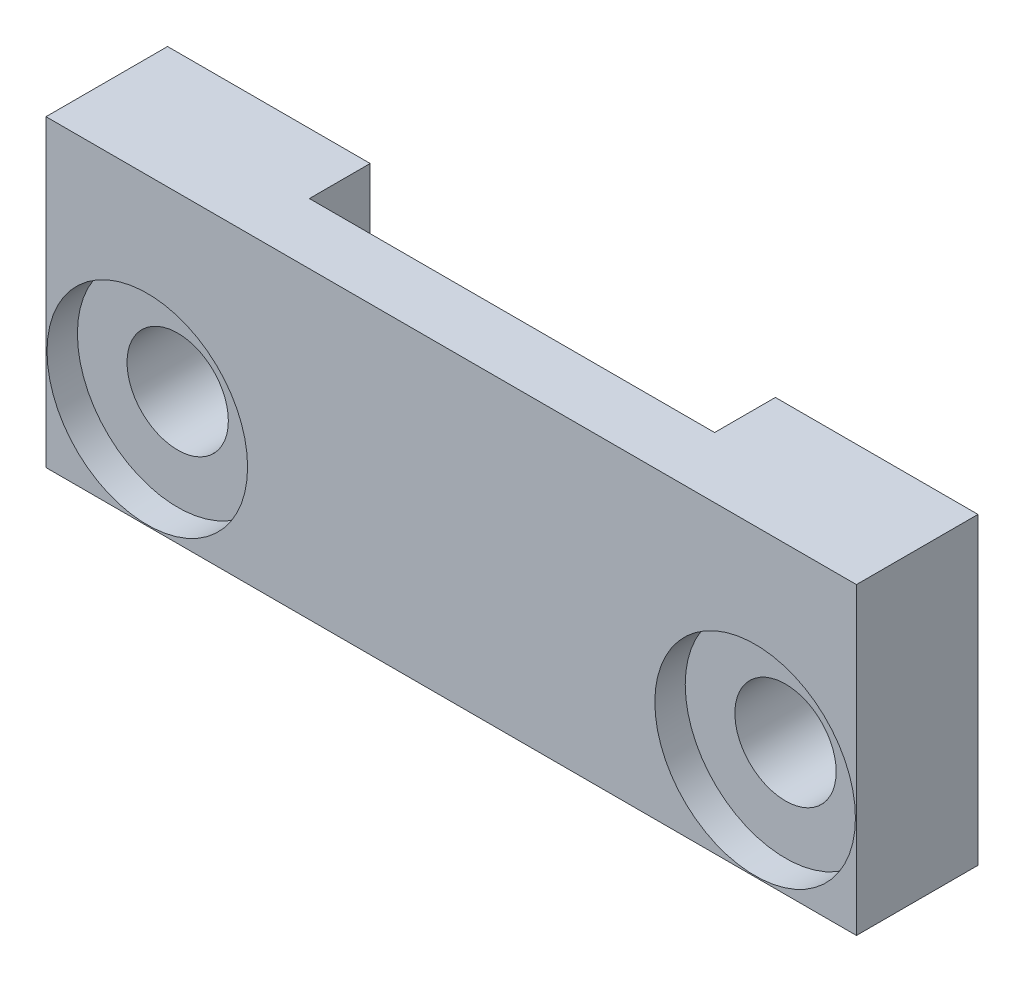
ISO-10303-21;
HEADER;
FILE_DESCRIPTION(('STEP AP214'),'2;1');
FILE_NAME('part.step','',(''),(''),'','','');
FILE_SCHEMA(('AUTOMOTIVE_DESIGN { 1 0 10303 214 1 1 1 1 }'));
ENDSEC;
DATA;
#1=APPLICATION_CONTEXT('core data for automotive mechanical design processes');
#2=APPLICATION_PROTOCOL_DEFINITION('international standard','automotive_design',2000,#1);
#3=PRODUCT_CONTEXT('',#1,'mechanical');
#4=PRODUCT('Part','Part','',(#3));
#5=PRODUCT_RELATED_PRODUCT_CATEGORY('part','',(#4));
#6=PRODUCT_DEFINITION_FORMATION('','',#4);
#7=PRODUCT_DEFINITION_CONTEXT('part definition',#1,'design');
#8=PRODUCT_DEFINITION('design','',#6,#7);
#9=PRODUCT_DEFINITION_SHAPE('','',#8);
#10=(LENGTH_UNIT() NAMED_UNIT(*) SI_UNIT(.MILLI.,.METRE.));
#11=(NAMED_UNIT(*) PLANE_ANGLE_UNIT() SI_UNIT($,.RADIAN.));
#12=(NAMED_UNIT(*) SI_UNIT($,.STERADIAN.) SOLID_ANGLE_UNIT());
#13=UNCERTAINTY_MEASURE_WITH_UNIT(LENGTH_MEASURE(1.E-05),#10,'distance_accuracy_value','');
#14=(GEOMETRIC_REPRESENTATION_CONTEXT(3) GLOBAL_UNCERTAINTY_ASSIGNED_CONTEXT((#13)) GLOBAL_UNIT_ASSIGNED_CONTEXT((#10,
#11,#12)) REPRESENTATION_CONTEXT('',''));
#15=CARTESIAN_POINT('',(0.,0.,0.));
#16=DIRECTION('',(0.,0.,1.));
#17=DIRECTION('',(1.,0.,0.));
#18=AXIS2_PLACEMENT_3D('',#15,#16,#17);
#19=CARTESIAN_POINT('',(-37.5328349769268,9.43589227208123,3.));
#20=DIRECTION('',(0.,0.,-1.));
#21=DIRECTION('',(-1.,0.,0.));
#22=AXIS2_PLACEMENT_3D('',#19,#20,#21);
#23=CYLINDRICAL_SURFACE('',#22,2.5);
#24=CARTESIAN_POINT('',(-37.5328349769268,9.43589227208123,-3.));
#25=DIRECTION('',(0.,0.,1.));
#26=DIRECTION('',(1.,0.,0.));
#27=AXIS2_PLACEMENT_3D('',#24,#25,#26);
#28=CIRCLE('',#27,2.5);
#29=CARTESIAN_POINT('',(-35.0328349769268,9.43589227208123,-3.));
#30=VERTEX_POINT('',#29);
#31=EDGE_CURVE('E157',#30,#30,#28,.T.);
#32=ORIENTED_EDGE('',*,*,#31,.F.);
#33=EDGE_LOOP('',(#32));
#34=FACE_BOUND('',#33,.T.);
#35=CARTESIAN_POINT('',(-37.5328349769268,9.43589227208123,1.5));
#36=DIRECTION('',(0.,0.,1.));
#37=DIRECTION('',(1.,0.,0.));
#38=AXIS2_PLACEMENT_3D('',#35,#36,#37);
#39=CIRCLE('',#38,2.5);
#40=CARTESIAN_POINT('',(-35.0328349769268,9.43589227208123,1.5));
#41=VERTEX_POINT('',#40);
#42=EDGE_CURVE('E218',#41,#41,#39,.T.);
#43=ORIENTED_EDGE('',*,*,#42,.T.);
#44=EDGE_LOOP('',(#43));
#45=FACE_BOUND('',#44,.T.);
#46=ADVANCED_FACE('F45',(#34,#45),#23,.F.);
#47=CARTESIAN_POINT('',(-7.53283497692682,9.43589227208123,3.));
#48=DIRECTION('',(0.,0.,-1.));
#49=DIRECTION('',(-1.,0.,0.));
#50=AXIS2_PLACEMENT_3D('',#47,#48,#49);
#51=CYLINDRICAL_SURFACE('',#50,2.5);
#52=CARTESIAN_POINT('',(-7.53283497692682,9.43589227208123,-3.));
#53=DIRECTION('',(0.,0.,1.));
#54=DIRECTION('',(1.,0.,0.));
#55=AXIS2_PLACEMENT_3D('',#52,#53,#54);
#56=CIRCLE('',#55,2.5);
#57=CARTESIAN_POINT('',(-5.03283497692682,9.43589227208123,-3.));
#58=VERTEX_POINT('',#57);
#59=EDGE_CURVE('E131',#58,#58,#56,.F.);
#60=ORIENTED_EDGE('',*,*,#59,.T.);
#61=EDGE_LOOP('',(#60));
#62=FACE_BOUND('',#61,.T.);
#63=CARTESIAN_POINT('',(-7.53283497692682,9.43589227208123,1.5));
#64=DIRECTION('',(0.,0.,1.));
#65=DIRECTION('',(1.,0.,0.));
#66=AXIS2_PLACEMENT_3D('',#63,#64,#65);
#67=CIRCLE('',#66,2.5);
#68=CARTESIAN_POINT('',(-5.03283497692682,9.43589227208123,1.5));
#69=VERTEX_POINT('',#68);
#70=EDGE_CURVE('E231',#69,#69,#67,.T.);
#71=ORIENTED_EDGE('',*,*,#70,.T.);
#72=EDGE_LOOP('',(#71));
#73=FACE_BOUND('',#72,.T.);
#74=ADVANCED_FACE('F206',(#62,#73),#51,.F.);
#75=CARTESIAN_POINT('',(0.,0.,0.));
#76=DIRECTION('',(0.,0.,1.));
#77=DIRECTION('',(1.,0.,0.));
#78=AXIS2_PLACEMENT_3D('',#75,#76,#77);
#79=PLANE('',#78);
#80=DIRECTION('',(0.,1.,0.));
#81=VECTOR('',#80,1.);
#82=CARTESIAN_POINT('',(-12.5328349769268,0.,0.));
#83=LINE('',#82,#81);
#84=CARTESIAN_POINT('',(-12.5328349769268,4.43589227208123,0.));
#85=VERTEX_POINT('',#84);
#86=CARTESIAN_POINT('',(-12.5328349769268,19.4358922720812,0.));
#87=VERTEX_POINT('',#86);
#88=EDGE_CURVE('E142',#85,#87,#83,.T.);
#89=ORIENTED_EDGE('',*,*,#88,.F.);
#90=DIRECTION('',(1.,0.,0.));
#91=VECTOR('',#90,1.);
#92=CARTESIAN_POINT('',(0.,4.43589227208123,0.));
#93=LINE('',#92,#91);
#94=CARTESIAN_POINT('',(-32.5328349769268,4.43589227208123,0.));
#95=VERTEX_POINT('',#94);
#96=EDGE_CURVE('E118',#95,#85,#93,.T.);
#97=ORIENTED_EDGE('',*,*,#96,.F.);
#98=DIRECTION('',(0.,1.,0.));
#99=VECTOR('',#98,1.);
#100=CARTESIAN_POINT('',(-32.5328349769268,0.,0.));
#101=LINE('',#100,#99);
#102=CARTESIAN_POINT('',(-32.5328349769268,19.4358922720812,0.));
#103=VERTEX_POINT('',#102);
#104=EDGE_CURVE('E145',#95,#103,#101,.T.);
#105=ORIENTED_EDGE('',*,*,#104,.T.);
#106=DIRECTION('',(1.,0.,0.));
#107=VECTOR('',#106,1.);
#108=CARTESIAN_POINT('',(0.,19.4358922720812,0.));
#109=LINE('',#108,#107);
#110=EDGE_CURVE('E167',#103,#87,#109,.T.);
#111=ORIENTED_EDGE('',*,*,#110,.T.);
#112=EDGE_LOOP('',(#89,#97,#105,#111));
#113=FACE_BOUND('',#112,.T.);
#114=ADVANCED_FACE('F211',(#113),#79,.F.);
#115=CARTESIAN_POINT('',(0.,4.43589227208123,3.));
#116=DIRECTION('',(0.,1.,0.));
#117=DIRECTION('',(0.,0.,1.));
#118=AXIS2_PLACEMENT_3D('',#115,#116,#117);
#119=PLANE('',#118);
#120=DIRECTION('',(0.,0.,-1.));
#121=VECTOR('',#120,1.);
#122=CARTESIAN_POINT('',(-42.5328349769268,4.43589227208123,3.));
#123=LINE('',#122,#121);
#124=CARTESIAN_POINT('',(-42.5328349769268,4.43589227208123,3.));
#125=VERTEX_POINT('',#124);
#126=CARTESIAN_POINT('',(-42.5328349769268,4.43589227208123,-3.));
#127=VERTEX_POINT('',#126);
#128=EDGE_CURVE('E174',#125,#127,#123,.T.);
#129=ORIENTED_EDGE('',*,*,#128,.T.);
#130=DIRECTION('',(1.,0.,0.));
#131=VECTOR('',#130,1.);
#132=CARTESIAN_POINT('',(0.,4.43589227208123,-3.));
#133=LINE('',#132,#131);
#134=CARTESIAN_POINT('',(-32.5328349769268,4.43589227208123,-3.));
#135=VERTEX_POINT('',#134);
#136=EDGE_CURVE('E147',#127,#135,#133,.T.);
#137=ORIENTED_EDGE('',*,*,#136,.T.);
#138=DIRECTION('',(0.,0.,1.));
#139=VECTOR('',#138,1.);
#140=CARTESIAN_POINT('',(-32.5328349769268,4.43589227208123,-3.));
#141=LINE('',#140,#139);
#142=EDGE_CURVE('E160',#135,#95,#141,.T.);
#143=ORIENTED_EDGE('',*,*,#142,.T.);
#144=ORIENTED_EDGE('',*,*,#96,.T.);
#145=DIRECTION('',(0.,0.,1.));
#146=VECTOR('',#145,1.);
#147=CARTESIAN_POINT('',(-12.5328349769268,4.43589227208123,-3.));
#148=LINE('',#147,#146);
#149=CARTESIAN_POINT('',(-12.5328349769268,4.43589227208123,-3.));
#150=VERTEX_POINT('',#149);
#151=EDGE_CURVE('E111',#150,#85,#148,.T.);
#152=ORIENTED_EDGE('',*,*,#151,.F.);
#153=DIRECTION('',(1.,0.,0.));
#154=VECTOR('',#153,1.);
#155=CARTESIAN_POINT('',(0.,4.43589227208123,-3.));
#156=LINE('',#155,#154);
#157=CARTESIAN_POINT('',(-2.53283497692682,4.43589227208123,-3.));
#158=VERTEX_POINT('',#157);
#159=EDGE_CURVE('E116',#150,#158,#156,.T.);
#160=ORIENTED_EDGE('',*,*,#159,.T.);
#161=DIRECTION('',(0.,0.,-1.));
#162=VECTOR('',#161,1.);
#163=CARTESIAN_POINT('',(-2.53283497692682,4.43589227208123,3.));
#164=LINE('',#163,#162);
#165=CARTESIAN_POINT('',(-2.53283497692682,4.43589227208123,3.));
#166=VERTEX_POINT('',#165);
#167=EDGE_CURVE('E12',#166,#158,#164,.T.);
#168=ORIENTED_EDGE('',*,*,#167,.F.);
#169=DIRECTION('',(1.,0.,0.));
#170=VECTOR('',#169,1.);
#171=CARTESIAN_POINT('',(0.,4.43589227208123,3.));
#172=LINE('',#171,#170);
#173=EDGE_CURVE('E164',#125,#166,#172,.T.);
#174=ORIENTED_EDGE('',*,*,#173,.F.);
#175=EDGE_LOOP('',(#129,#137,#143,#144,#152,#160,#168,#174));
#176=FACE_BOUND('',#175,.T.);
#177=ADVANCED_FACE('F113',(#176),#119,.F.);
#178=CARTESIAN_POINT('',(-2.53283497692682,0.,3.));
#179=DIRECTION('',(1.,0.,0.));
#180=DIRECTION('',(0.,0.,-1.));
#181=AXIS2_PLACEMENT_3D('',#178,#179,#180);
#182=PLANE('',#181);
#183=ORIENTED_EDGE('',*,*,#167,.T.);
#184=DIRECTION('',(0.,-1.,0.));
#185=VECTOR('',#184,1.);
#186=CARTESIAN_POINT('',(-2.53283497692682,0.,-3.));
#187=LINE('',#186,#185);
#188=CARTESIAN_POINT('',(-2.53283497692682,19.4358922720812,-3.));
#189=VERTEX_POINT('',#188);
#190=EDGE_CURVE('E136',#189,#158,#187,.T.);
#191=ORIENTED_EDGE('',*,*,#190,.F.);
#192=DIRECTION('',(0.,0.,-1.));
#193=VECTOR('',#192,1.);
#194=CARTESIAN_POINT('',(-2.53283497692682,19.4358922720812,3.));
#195=LINE('',#194,#193);
#196=CARTESIAN_POINT('',(-2.53283497692682,19.4358922720812,3.));
#197=VERTEX_POINT('',#196);
#198=EDGE_CURVE('E52',#197,#189,#195,.T.);
#199=ORIENTED_EDGE('',*,*,#198,.F.);
#200=DIRECTION('',(0.,-1.,0.));
#201=VECTOR('',#200,1.);
#202=CARTESIAN_POINT('',(-2.53283497692682,0.,3.));
#203=LINE('',#202,#201);
#204=EDGE_CURVE('E166',#197,#166,#203,.T.);
#205=ORIENTED_EDGE('',*,*,#204,.T.);
#206=EDGE_LOOP('',(#183,#191,#199,#205));
#207=FACE_BOUND('',#206,.T.);
#208=ADVANCED_FACE('F185',(#207),#182,.T.);
#209=CARTESIAN_POINT('',(0.,19.4358922720812,3.));
#210=DIRECTION('',(0.,1.,0.));
#211=DIRECTION('',(0.,0.,1.));
#212=AXIS2_PLACEMENT_3D('',#209,#210,#211);
#213=PLANE('',#212);
#214=ORIENTED_EDGE('',*,*,#110,.F.);
#215=DIRECTION('',(0.,0.,1.));
#216=VECTOR('',#215,1.);
#217=CARTESIAN_POINT('',(-32.5328349769268,19.4358922720812,-3.));
#218=LINE('',#217,#216);
#219=CARTESIAN_POINT('',(-32.5328349769268,19.4358922720812,-3.));
#220=VERTEX_POINT('',#219);
#221=EDGE_CURVE('E59',#220,#103,#218,.T.);
#222=ORIENTED_EDGE('',*,*,#221,.F.);
#223=DIRECTION('',(1.,0.,0.));
#224=VECTOR('',#223,1.);
#225=CARTESIAN_POINT('',(0.,19.4358922720812,-3.));
#226=LINE('',#225,#224);
#227=CARTESIAN_POINT('',(-42.5328349769268,19.4358922720812,-3.));
#228=VERTEX_POINT('',#227);
#229=EDGE_CURVE('E152',#228,#220,#226,.T.);
#230=ORIENTED_EDGE('',*,*,#229,.F.);
#231=DIRECTION('',(0.,0.,-1.));
#232=VECTOR('',#231,1.);
#233=CARTESIAN_POINT('',(-42.5328349769268,19.4358922720812,3.));
#234=LINE('',#233,#232);
#235=CARTESIAN_POINT('',(-42.5328349769268,19.4358922720812,3.));
#236=VERTEX_POINT('',#235);
#237=EDGE_CURVE('E179',#236,#228,#234,.T.);
#238=ORIENTED_EDGE('',*,*,#237,.F.);
#239=DIRECTION('',(1.,0.,0.));
#240=VECTOR('',#239,1.);
#241=CARTESIAN_POINT('',(0.,19.4358922720812,3.));
#242=LINE('',#241,#240);
#243=EDGE_CURVE('E170',#236,#197,#242,.T.);
#244=ORIENTED_EDGE('',*,*,#243,.T.);
#245=ORIENTED_EDGE('',*,*,#198,.T.);
#246=DIRECTION('',(1.,0.,0.));
#247=VECTOR('',#246,1.);
#248=CARTESIAN_POINT('',(0.,19.4358922720812,-3.));
#249=LINE('',#248,#247);
#250=CARTESIAN_POINT('',(-12.5328349769268,19.4358922720812,-3.));
#251=VERTEX_POINT('',#250);
#252=EDGE_CURVE('E123',#251,#189,#249,.T.);
#253=ORIENTED_EDGE('',*,*,#252,.F.);
#254=DIRECTION('',(0.,0.,1.));
#255=VECTOR('',#254,1.);
#256=CARTESIAN_POINT('',(-12.5328349769268,19.4358922720812,-3.));
#257=LINE('',#256,#255);
#258=EDGE_CURVE('E122',#251,#87,#257,.T.);
#259=ORIENTED_EDGE('',*,*,#258,.T.);
#260=EDGE_LOOP('',(#214,#222,#230,#238,#244,#245,#253,#259));
#261=FACE_BOUND('',#260,.T.);
#262=ADVANCED_FACE('F182',(#261),#213,.T.);
#263=CARTESIAN_POINT('',(-42.5328349769268,0.,3.));
#264=DIRECTION('',(1.,0.,0.));
#265=DIRECTION('',(0.,0.,-1.));
#266=AXIS2_PLACEMENT_3D('',#263,#264,#265);
#267=PLANE('',#266);
#268=ORIENTED_EDGE('',*,*,#237,.T.);
#269=DIRECTION('',(0.,-1.,0.));
#270=VECTOR('',#269,1.);
#271=CARTESIAN_POINT('',(-42.5328349769268,0.,-3.));
#272=LINE('',#271,#270);
#273=EDGE_CURVE('E154',#228,#127,#272,.T.);
#274=ORIENTED_EDGE('',*,*,#273,.T.);
#275=ORIENTED_EDGE('',*,*,#128,.F.);
#276=DIRECTION('',(0.,-1.,0.));
#277=VECTOR('',#276,1.);
#278=CARTESIAN_POINT('',(-42.5328349769268,0.,3.));
#279=LINE('',#278,#277);
#280=EDGE_CURVE('E67',#236,#125,#279,.T.);
#281=ORIENTED_EDGE('',*,*,#280,.F.);
#282=EDGE_LOOP('',(#268,#274,#275,#281));
#283=FACE_BOUND('',#282,.T.);
#284=ADVANCED_FACE('F191',(#283),#267,.F.);
#285=CARTESIAN_POINT('',(0.,0.,3.));
#286=DIRECTION('',(0.,0.,1.));
#287=DIRECTION('',(1.,0.,0.));
#288=AXIS2_PLACEMENT_3D('',#285,#286,#287);
#289=PLANE('',#288);
#290=CARTESIAN_POINT('',(-37.5328349769268,9.43589227208123,3.));
#291=DIRECTION('',(0.,0.,1.));
#292=DIRECTION('',(1.,0.,0.));
#293=AXIS2_PLACEMENT_3D('',#290,#291,#292);
#294=CIRCLE('',#293,4.94999999999999);
#295=CARTESIAN_POINT('',(-32.5828349769268,9.43589227208123,3.));
#296=VERTEX_POINT('',#295);
#297=EDGE_CURVE('E220',#296,#296,#294,.T.);
#298=ORIENTED_EDGE('',*,*,#297,.F.);
#299=EDGE_LOOP('',(#298));
#300=FACE_BOUND('',#299,.T.);
#301=CARTESIAN_POINT('',(-7.53283497692682,9.43589227208123,3.));
#302=DIRECTION('',(0.,0.,1.));
#303=DIRECTION('',(1.,0.,0.));
#304=AXIS2_PLACEMENT_3D('',#301,#302,#303);
#305=CIRCLE('',#304,4.94999999999999);
#306=CARTESIAN_POINT('',(-2.58283497692683,9.43589227208123,3.));
#307=VERTEX_POINT('',#306);
#308=EDGE_CURVE('E226',#307,#307,#305,.T.);
#309=ORIENTED_EDGE('',*,*,#308,.F.);
#310=EDGE_LOOP('',(#309));
#311=FACE_BOUND('',#310,.T.);
#312=ORIENTED_EDGE('',*,*,#173,.T.);
#313=ORIENTED_EDGE('',*,*,#204,.F.);
#314=ORIENTED_EDGE('',*,*,#243,.F.);
#315=ORIENTED_EDGE('',*,*,#280,.T.);
#316=EDGE_LOOP('',(#312,#313,#314,#315));
#317=FACE_BOUND('',#316,.T.);
#318=ADVANCED_FACE('F188',(#300,#311,#317),#289,.T.);
#319=CARTESIAN_POINT('',(-32.5328349769268,0.,-3.));
#320=DIRECTION('',(1.,0.,0.));
#321=DIRECTION('',(0.,0.,-1.));
#322=AXIS2_PLACEMENT_3D('',#319,#320,#321);
#323=PLANE('',#322);
#324=ORIENTED_EDGE('',*,*,#104,.F.);
#325=ORIENTED_EDGE('',*,*,#142,.F.);
#326=DIRECTION('',(0.,1.,0.));
#327=VECTOR('',#326,1.);
#328=CARTESIAN_POINT('',(-32.5328349769268,0.,-3.));
#329=LINE('',#328,#327);
#330=EDGE_CURVE('E150',#135,#220,#329,.T.);
#331=ORIENTED_EDGE('',*,*,#330,.T.);
#332=ORIENTED_EDGE('',*,*,#221,.T.);
#333=EDGE_LOOP('',(#324,#325,#331,#332));
#334=FACE_BOUND('',#333,.T.);
#335=ADVANCED_FACE('F190',(#334),#323,.T.);
#336=CARTESIAN_POINT('',(0.,0.,-3.));
#337=DIRECTION('',(0.,0.,1.));
#338=DIRECTION('',(1.,0.,0.));
#339=AXIS2_PLACEMENT_3D('',#336,#337,#338);
#340=PLANE('',#339);
#341=ORIENTED_EDGE('',*,*,#136,.F.);
#342=ORIENTED_EDGE('',*,*,#273,.F.);
#343=ORIENTED_EDGE('',*,*,#229,.T.);
#344=ORIENTED_EDGE('',*,*,#330,.F.);
#345=EDGE_LOOP('',(#341,#342,#343,#344));
#346=FACE_BOUND('',#345,.T.);
#347=ORIENTED_EDGE('',*,*,#31,.T.);
#348=EDGE_LOOP('',(#347));
#349=FACE_BOUND('',#348,.T.);
#350=ADVANCED_FACE('F198',(#346,#349),#340,.F.);
#351=CARTESIAN_POINT('',(-12.5328349769268,0.,-3.));
#352=DIRECTION('',(1.,0.,0.));
#353=DIRECTION('',(0.,0.,-1.));
#354=AXIS2_PLACEMENT_3D('',#351,#352,#353);
#355=PLANE('',#354);
#356=ORIENTED_EDGE('',*,*,#88,.T.);
#357=ORIENTED_EDGE('',*,*,#258,.F.);
#358=DIRECTION('',(0.,1.,0.));
#359=VECTOR('',#358,1.);
#360=CARTESIAN_POINT('',(-12.5328349769268,0.,-3.));
#361=LINE('',#360,#359);
#362=EDGE_CURVE('E127',#150,#251,#361,.T.);
#363=ORIENTED_EDGE('',*,*,#362,.F.);
#364=ORIENTED_EDGE('',*,*,#151,.T.);
#365=EDGE_LOOP('',(#356,#357,#363,#364));
#366=FACE_BOUND('',#365,.T.);
#367=ADVANCED_FACE('F128',(#366),#355,.F.);
#368=CARTESIAN_POINT('',(0.,0.,-3.));
#369=DIRECTION('',(0.,0.,1.));
#370=DIRECTION('',(1.,0.,0.));
#371=AXIS2_PLACEMENT_3D('',#368,#369,#370);
#372=PLANE('',#371);
#373=ORIENTED_EDGE('',*,*,#59,.F.);
#374=EDGE_LOOP('',(#373));
#375=FACE_BOUND('',#374,.T.);
#376=ORIENTED_EDGE('',*,*,#362,.T.);
#377=ORIENTED_EDGE('',*,*,#252,.T.);
#378=ORIENTED_EDGE('',*,*,#190,.T.);
#379=ORIENTED_EDGE('',*,*,#159,.F.);
#380=EDGE_LOOP('',(#376,#377,#378,#379));
#381=FACE_BOUND('',#380,.T.);
#382=ADVANCED_FACE('F134',(#375,#381),#372,.F.);
#383=CARTESIAN_POINT('',(-7.53283497692682,9.43589227208123,1.5));
#384=DIRECTION('',(0.,0.,1.));
#385=DIRECTION('',(1.,0.,0.));
#386=AXIS2_PLACEMENT_3D('',#383,#384,#385);
#387=CYLINDRICAL_SURFACE('',#386,4.94999999999999);
#388=CARTESIAN_POINT('',(-7.53283497692682,9.43589227208123,1.5));
#389=DIRECTION('',(0.,0.,1.));
#390=DIRECTION('',(1.,0.,0.));
#391=AXIS2_PLACEMENT_3D('',#388,#389,#390);
#392=CIRCLE('',#391,4.94999999999999);
#393=CARTESIAN_POINT('',(-2.58283497692683,9.43589227208123,1.5));
#394=VERTEX_POINT('',#393);
#395=EDGE_CURVE('E221',#394,#394,#392,.T.);
#396=ORIENTED_EDGE('',*,*,#395,.F.);
#397=EDGE_LOOP('',(#396));
#398=FACE_BOUND('',#397,.T.);
#399=ORIENTED_EDGE('',*,*,#308,.T.);
#400=EDGE_LOOP('',(#399));
#401=FACE_BOUND('',#400,.T.);
#402=ADVANCED_FACE('F240',(#398,#401),#387,.F.);
#403=CARTESIAN_POINT('',(-7.53283497692682,9.43589227208123,1.5));
#404=DIRECTION('',(0.,0.,1.));
#405=DIRECTION('',(1.,0.,0.));
#406=AXIS2_PLACEMENT_3D('',#403,#404,#405);
#407=PLANE('',#406);
#408=ORIENTED_EDGE('',*,*,#70,.F.);
#409=EDGE_LOOP('',(#408));
#410=FACE_BOUND('',#409,.T.);
#411=ORIENTED_EDGE('',*,*,#395,.T.);
#412=EDGE_LOOP('',(#411));
#413=FACE_BOUND('',#412,.T.);
#414=ADVANCED_FACE('F246',(#410,#413),#407,.T.);
#415=CARTESIAN_POINT('',(-37.5328349769268,9.43589227208123,1.5));
#416=DIRECTION('',(0.,0.,1.));
#417=DIRECTION('',(1.,0.,0.));
#418=AXIS2_PLACEMENT_3D('',#415,#416,#417);
#419=CYLINDRICAL_SURFACE('',#418,4.94999999999999);
#420=CARTESIAN_POINT('',(-37.5328349769268,9.43589227208123,1.5));
#421=DIRECTION('',(0.,0.,1.));
#422=DIRECTION('',(1.,0.,0.));
#423=AXIS2_PLACEMENT_3D('',#420,#421,#422);
#424=CIRCLE('',#423,4.94999999999999);
#425=CARTESIAN_POINT('',(-32.5828349769268,9.43589227208123,1.5));
#426=VERTEX_POINT('',#425);
#427=EDGE_CURVE('E144',#426,#426,#424,.T.);
#428=ORIENTED_EDGE('',*,*,#427,.F.);
#429=EDGE_LOOP('',(#428));
#430=FACE_BOUND('',#429,.T.);
#431=ORIENTED_EDGE('',*,*,#297,.T.);
#432=EDGE_LOOP('',(#431));
#433=FACE_BOUND('',#432,.T.);
#434=ADVANCED_FACE('F337',(#430,#433),#419,.F.);
#435=CARTESIAN_POINT('',(-37.5328349769268,9.43589227208123,1.5));
#436=DIRECTION('',(0.,0.,1.));
#437=DIRECTION('',(1.,0.,0.));
#438=AXIS2_PLACEMENT_3D('',#435,#436,#437);
#439=PLANE('',#438);
#440=ORIENTED_EDGE('',*,*,#42,.F.);
#441=EDGE_LOOP('',(#440));
#442=FACE_BOUND('',#441,.T.);
#443=ORIENTED_EDGE('',*,*,#427,.T.);
#444=EDGE_LOOP('',(#443));
#445=FACE_BOUND('',#444,.T.);
#446=ADVANCED_FACE('F346',(#442,#445),#439,.T.);
#447=CLOSED_SHELL('',(#46,#74,#114,#177,#208,#262,#284,#318,#335,#350,#367,#382,#402,#414,#434,#446));
#448=MANIFOLD_SOLID_BREP('B2',#447);
#449=ADVANCED_BREP_SHAPE_REPRESENTATION('',(#18,#448),#14);
#450=SHAPE_DEFINITION_REPRESENTATION(#9,#449);
ENDSEC;
END-ISO-10303-21;
